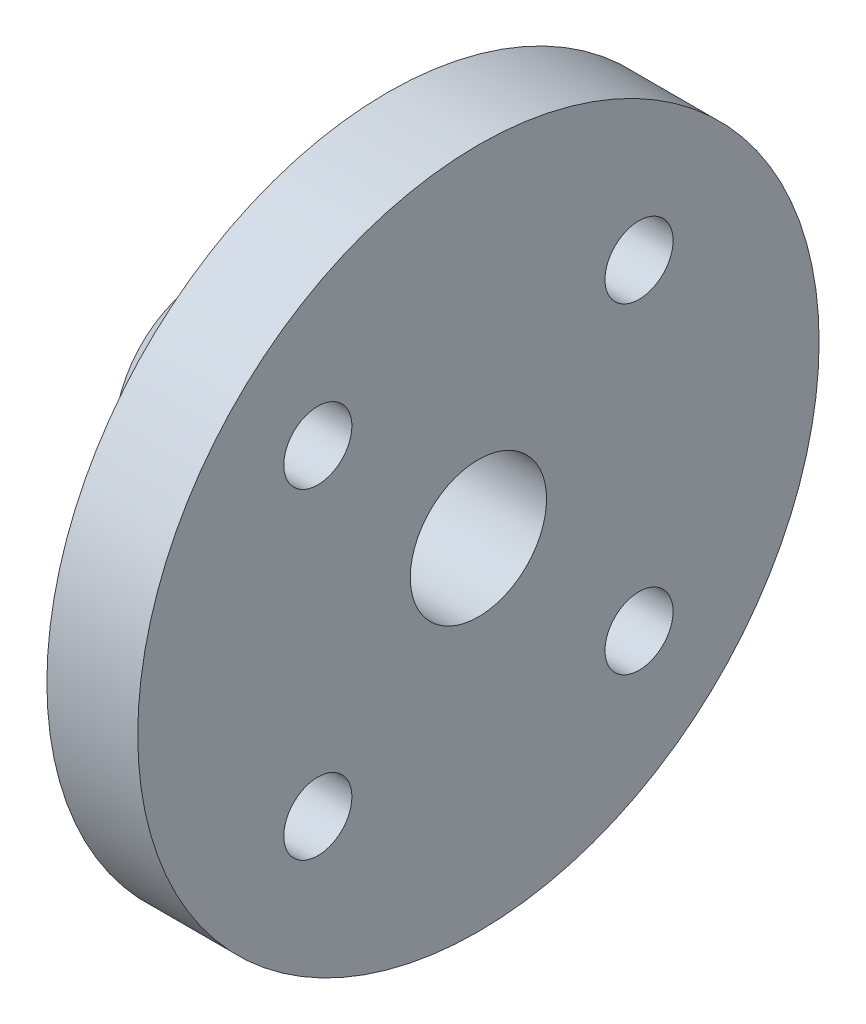
ISO-10303-21;
HEADER;
FILE_DESCRIPTION(('STEP AP214'),'2;1');
FILE_NAME('part.step','',(''),(''),'','','');
FILE_SCHEMA(('AUTOMOTIVE_DESIGN { 1 0 10303 214 1 1 1 1 }'));
ENDSEC;
DATA;
#1=APPLICATION_CONTEXT('core data for automotive mechanical design processes');
#2=APPLICATION_PROTOCOL_DEFINITION('international standard','automotive_design',2000,#1);
#3=PRODUCT_CONTEXT('',#1,'mechanical');
#4=PRODUCT('Part','Part','',(#3));
#5=PRODUCT_RELATED_PRODUCT_CATEGORY('part','',(#4));
#6=PRODUCT_DEFINITION_FORMATION('','',#4);
#7=PRODUCT_DEFINITION_CONTEXT('part definition',#1,'design');
#8=PRODUCT_DEFINITION('design','',#6,#7);
#9=PRODUCT_DEFINITION_SHAPE('','',#8);
#10=(LENGTH_UNIT() NAMED_UNIT(*) SI_UNIT(.MILLI.,.METRE.));
#11=(NAMED_UNIT(*) PLANE_ANGLE_UNIT() SI_UNIT($,.RADIAN.));
#12=(NAMED_UNIT(*) SI_UNIT($,.STERADIAN.) SOLID_ANGLE_UNIT());
#13=UNCERTAINTY_MEASURE_WITH_UNIT(LENGTH_MEASURE(1.E-05),#10,'distance_accuracy_value','');
#14=(GEOMETRIC_REPRESENTATION_CONTEXT(3) GLOBAL_UNCERTAINTY_ASSIGNED_CONTEXT((#13)) GLOBAL_UNIT_ASSIGNED_CONTEXT((#10,
#11,#12)) REPRESENTATION_CONTEXT('',''));
#15=CARTESIAN_POINT('',(0.,0.,0.));
#16=DIRECTION('',(0.,0.,1.));
#17=DIRECTION('',(1.,0.,0.));
#18=AXIS2_PLACEMENT_3D('',#15,#16,#17);
#19=CARTESIAN_POINT('',(0.,0.,0.));
#20=DIRECTION('',(-1.,0.,0.));
#21=DIRECTION('',(0.,0.,1.));
#22=AXIS2_PLACEMENT_3D('',#19,#20,#21);
#23=CYLINDRICAL_SURFACE('',#22,3.);
#24=CARTESIAN_POINT('',(4.,-2.59807621135332,1.5));
#25=CARTESIAN_POINT('',(3.92183828770712,-2.59808302092689,1.4999945446118));
#26=CARTESIAN_POINT('',(3.84357788271243,-2.60165701781635,1.49384995609982));
#27=CARTESIAN_POINT('',(3.68945910298427,-2.61543549678079,1.46958481484708));
#28=CARTESIAN_POINT('',(3.61360612743489,-2.62565391083339,1.45143909683127));
#29=CARTESIAN_POINT('',(3.46682250348409,-2.65124019908098,1.40414992304972));
#30=CARTESIAN_POINT('',(3.39586802128962,-2.66658065209878,1.3750649287406));
#31=CARTESIAN_POINT('',(3.25986369700492,-2.70063997225287,1.30690128806456));
#32=CARTESIAN_POINT('',(3.19481417460631,-2.71935902214097,1.26782210105366));
#33=CARTESIAN_POINT('',(3.06654140716374,-2.75995303586162,1.17699981079632));
#34=CARTESIAN_POINT('',(3.00391129648968,-2.7819609545693,1.12447805421566));
#35=CARTESIAN_POINT('',(2.88788741738994,-2.82557974178559,1.0098807114217));
#36=CARTESIAN_POINT('',(2.83449825612472,-2.84719040746875,0.94780038867344));
#37=CARTESIAN_POINT('',(2.73494927327851,-2.88932215429424,0.81073434512182));
#38=CARTESIAN_POINT('',(2.6895193482107,-2.90967159627259,0.735160783518863));
#39=CARTESIAN_POINT('',(2.61228872013136,-2.94526134149293,0.576235539899257));
#40=CARTESIAN_POINT('',(2.58047941579424,-2.96050486775612,0.492888807207233));
#41=CARTESIAN_POINT('',(2.53374300804835,-2.98320691866356,0.327067415888966));
#42=CARTESIAN_POINT('',(2.5177757104667,-2.99114220331338,0.244952685733227));
#43=CARTESIAN_POINT('',(2.49975082198744,-3.000113757691,0.0788559430467733));
#44=CARTESIAN_POINT('',(2.49768481480643,-3.00115420176885,-0.00512490876560659));
#45=CARTESIAN_POINT('',(2.50712001095552,-2.99644472874675,-0.164748786635624));
#46=CARTESIAN_POINT('',(2.51745702328183,-2.99127743838241,-0.240481798765186));
#47=CARTESIAN_POINT('',(2.54932126585698,-2.97561367889621,-0.388970657877482));
#48=CARTESIAN_POINT('',(2.57084933346433,-2.96511681099591,-0.461726281640887));
#49=CARTESIAN_POINT('',(2.62462384913472,-2.93957374931482,-0.603464087354329));
#50=CARTESIAN_POINT('',(2.6570144697581,-2.92446662293799,-0.672380135272766));
#51=CARTESIAN_POINT('',(2.73139512430224,-2.89106468980031,-0.803965202269992));
#52=CARTESIAN_POINT('',(2.77338859495352,-2.87276874236226,-0.866631973257967));
#53=CARTESIAN_POINT('',(2.87034302729952,-2.83266591598844,-0.990260491347291));
#54=CARTESIAN_POINT('',(2.92615454248901,-2.81069063997263,-1.05050111254404));
#55=CARTESIAN_POINT('',(3.04688458739526,-2.76681510880218,-1.16115655544667));
#56=CARTESIAN_POINT('',(3.11181005841109,-2.74491492398443,-1.21156381736134));
#57=CARTESIAN_POINT('',(3.25397228863613,-2.70216234138727,-1.30425800196332));
#58=CARTESIAN_POINT('',(3.33172903458131,-2.68146479986061,-1.34582597246708));
#59=CARTESIAN_POINT('',(3.4944065070385,-2.64563175417864,-1.41497866950185));
#60=CARTESIAN_POINT('',(3.57931964952634,-2.63049045069101,-1.44257798731633));
#61=CARTESIAN_POINT('',(3.74682176692418,-2.60916953725552,-1.48077031653756));
#62=CARTESIAN_POINT('',(3.82906167856533,-2.60237483772745,-1.49253768317996));
#63=CARTESIAN_POINT('',(3.99460201227481,-2.59676879042414,-1.50227541991714));
#64=CARTESIAN_POINT('',(4.07790164367968,-2.59795180333967,-1.50025553597254));
#65=CARTESIAN_POINT('',(4.23348087786809,-2.60751504810877,-1.48355406501595));
#66=CARTESIAN_POINT('',(4.30596917666189,-2.61509381259981,-1.4702817250687));
#67=CARTESIAN_POINT('',(4.44755167940644,-2.63541032327012,-1.43354442694866));
#68=CARTESIAN_POINT('',(4.51664477611991,-2.64814974007551,-1.41007616793542));
#69=CARTESIAN_POINT('',(4.65311699635404,-2.67804333119485,-1.35247138290733));
#70=CARTESIAN_POINT('',(4.72026852528033,-2.69537464864595,-1.31789109553909));
#71=CARTESIAN_POINT('',(4.84820390730849,-2.73234179245875,-1.23943059602371));
#72=CARTESIAN_POINT('',(4.90898446526992,-2.75197880032721,-1.19554560649832));
#73=CARTESIAN_POINT('',(5.03046815128532,-2.79431997684504,-1.09325575079828));
#74=CARTESIAN_POINT('',(5.09019572607649,-2.81709874731433,-1.03371790847245));
#75=CARTESIAN_POINT('',(5.19911835699038,-2.86101352466839,-0.905106743097435));
#76=CARTESIAN_POINT('',(5.24830985534581,-2.88214897511564,-0.836030211983022));
#77=CARTESIAN_POINT('',(5.33586058892515,-2.92112042536435,-0.687803043838137));
#78=CARTESIAN_POINT('',(5.37389967731636,-2.93885462508044,-0.608434646361171));
#79=CARTESIAN_POINT('',(5.43570685578609,-2.96825032438951,-0.443283546961624));
#80=CARTESIAN_POINT('',(5.45948747704946,-2.97991715514559,-0.357506552088265));
#81=CARTESIAN_POINT('',(5.49005284626199,-2.99501262272824,-0.190469523495627));
#82=CARTESIAN_POINT('',(5.49819681381417,-2.99909891862287,-0.109517165775687));
#83=CARTESIAN_POINT('',(5.5012648981816,-3.00063195562697,0.052688978926804));
#84=CARTESIAN_POINT('',(5.49619364278534,-2.99808102100335,0.133942650442629));
#85=CARTESIAN_POINT('',(5.47387538980656,-2.98700953256884,0.28880698847572));
#86=CARTESIAN_POINT('',(5.45745272611349,-2.97889342001985,0.362568476716895));
#87=CARTESIAN_POINT('',(5.41400950104554,-2.95788140495135,0.506168928275425));
#88=CARTESIAN_POINT('',(5.38698741985982,-2.94498481699194,0.576007327433262));
#89=CARTESIAN_POINT('',(5.32190942175104,-2.9148889612218,0.713135109367326));
#90=CARTESIAN_POINT('',(5.28343101518824,-2.89752925798199,0.780187714050068));
#91=CARTESIAN_POINT('',(5.19706310371142,-2.86032199712739,0.907161962721036));
#92=CARTESIAN_POINT('',(5.14916927632649,-2.84047329837541,0.967080311122359));
#93=CARTESIAN_POINT('',(5.03980429146594,-2.79792915339941,1.08437100623534));
#94=CARTESIAN_POINT('',(4.97745626878421,-2.77514698517547,1.14089652680891));
#95=CARTESIAN_POINT('',(4.84382391830534,-2.73094614244279,1.24299493109201));
#96=CARTESIAN_POINT('',(4.77253176869847,-2.70952868642798,1.28855812501509));
#97=CARTESIAN_POINT('',(4.62004503012857,-2.66999407957374,1.36864661967848));
#98=CARTESIAN_POINT('',(4.53860870330689,-2.65200261384405,1.40277759894141));
#99=CARTESIAN_POINT('',(4.37000139349033,-2.62299234492527,1.45631806425962));
#100=CARTESIAN_POINT('',(4.28285066663097,-2.61195024221553,1.47577678676302));
#101=CARTESIAN_POINT('',(4.162291966522,-2.60293908902686,1.49155051179662));
#102=CARTESIAN_POINT('',(4.12994815840317,-2.60112193507728,1.49471415744578));
#103=CARTESIAN_POINT('',(4.06507527897663,-2.59868903831625,1.49894010763494));
#104=CARTESIAN_POINT('',(4.03254619542119,-2.59807337587664,1.50000227159981));
#105=CARTESIAN_POINT('',(4.,-2.59807621135332,1.5));
#106=B_SPLINE_CURVE_WITH_KNOTS('',3,(#24,#25,#26,#27,#28,#29,#30,#31,#32,#33,#34,#35,#36,#37,
#38,#39,#40,#41,#42,#43,#44,#45,#46,#47,#48,#49,#50,#51,#52,#53,#54,#55,#56,#57,#58,#59,#60,#61,
#62,#63,#64,#65,#66,#67,#68,#69,#70,#71,#72,#73,#74,#75,#76,#77,#78,#79,#80,#81,#82,#83,#84,#85,
#86,#87,#88,#89,#90,#91,#92,#93,#94,#95,#96,#97,#98,#99,#100,#101,#102,#103,#104,#105),
.UNSPECIFIED.,.T.,.F.,(4,2,2,2,2,2,2,2,2,2,2,2,2,2,2,2,2,2,2,2,2,2,2,2,2,2,2,2,2,2,2,2,2,2,2,2,
2,2,2,2,4),(0.,0.234348183892073,0.469189339237207,0.702792893878328,0.936409088167724,
1.18929346874735,1.44230356626556,1.71236838358145,1.98226240445836,2.23295227451903,
2.4834903552906,2.71224146226807,2.94100968776183,3.1729430209672,3.40495949025408,
3.65890787185336,3.91305072368878,4.18333262594173,4.45333161317557,4.70193436281318,
4.95036139782559,5.17161275136038,5.39293578654094,5.62450944609131,5.85620229330071,
6.11710115370919,6.37808797467303,6.64596272119448,6.91360169713157,7.1566840558423,
7.39968130190957,7.62666637307239,7.85368400268019,8.09041126079207,8.32724745151078,
8.58765362775101,8.84828914267731,9.11716123557907,9.3851269950414,9.48270202777964,
9.5802835874181),.UNSPECIFIED.);
#107=CARTESIAN_POINT('',(4.,-2.59807621135332,1.5));
#108=VERTEX_POINT('',#107);
#109=EDGE_CURVE('E71',#108,#108,#106,.T.);
#110=ORIENTED_EDGE('',*,*,#109,.T.);
#111=EDGE_LOOP('',(#110));
#112=FACE_BOUND('',#111,.T.);
#113=CARTESIAN_POINT('',(12.,0.,0.));
#114=DIRECTION('',(-1.,0.,0.));
#115=DIRECTION('',(0.,0.,1.));
#116=AXIS2_PLACEMENT_3D('',#113,#114,#115);
#117=CIRCLE('',#116,3.);
#118=CARTESIAN_POINT('',(12.,0.,3.));
#119=VERTEX_POINT('',#118);
#120=EDGE_CURVE('E40',#119,#119,#117,.T.);
#121=ORIENTED_EDGE('',*,*,#120,.F.);
#122=EDGE_LOOP('',(#121));
#123=FACE_BOUND('',#122,.T.);
#124=CARTESIAN_POINT('',(0.,0.,0.));
#125=DIRECTION('',(-1.,0.,0.));
#126=DIRECTION('',(0.,0.,1.));
#127=AXIS2_PLACEMENT_3D('',#124,#125,#126);
#128=CIRCLE('',#127,3.);
#129=CARTESIAN_POINT('',(0.,0.,3.));
#130=VERTEX_POINT('',#129);
#131=EDGE_CURVE('E78',#130,#130,#128,.T.);
#132=ORIENTED_EDGE('',*,*,#131,.T.);
#133=EDGE_LOOP('',(#132));
#134=FACE_BOUND('',#133,.T.);
#135=ADVANCED_FACE('F32',(#112,#123,#134),#23,.F.);
#136=CARTESIAN_POINT('',(12.,3.,0.));
#137=DIRECTION('',(-1.,0.,0.));
#138=DIRECTION('',(0.,0.,1.));
#139=AXIS2_PLACEMENT_3D('',#136,#137,#138);
#140=PLANE('',#139);
#141=CARTESIAN_POINT('',(12.,-7.07106781186549,7.07106781186546));
#142=DIRECTION('',(1.,0.,0.));
#143=DIRECTION('',(0.,0.,-1.));
#144=AXIS2_PLACEMENT_3D('',#141,#142,#143);
#145=CIRCLE('',#144,1.49999999999999);
#146=CARTESIAN_POINT('',(12.,-7.07106781186549,5.57106781186547));
#147=VERTEX_POINT('',#146);
#148=EDGE_CURVE('E219',#147,#147,#145,.T.);
#149=ORIENTED_EDGE('',*,*,#148,.F.);
#150=EDGE_LOOP('',(#149));
#151=FACE_BOUND('',#150,.T.);
#152=CARTESIAN_POINT('',(12.,-7.07106781186546,-7.07106781186549));
#153=DIRECTION('',(1.,0.,0.));
#154=DIRECTION('',(0.,0.,-1.));
#155=AXIS2_PLACEMENT_3D('',#152,#153,#154);
#156=CIRCLE('',#155,1.49999999999999);
#157=CARTESIAN_POINT('',(12.,-7.07106781186546,-8.57106781186548));
#158=VERTEX_POINT('',#157);
#159=EDGE_CURVE('E237',#158,#158,#156,.T.);
#160=ORIENTED_EDGE('',*,*,#159,.F.);
#161=EDGE_LOOP('',(#160));
#162=FACE_BOUND('',#161,.T.);
#163=CARTESIAN_POINT('',(12.,7.07106781186549,-7.07106781186546));
#164=DIRECTION('',(1.,0.,0.));
#165=DIRECTION('',(0.,0.,-1.));
#166=AXIS2_PLACEMENT_3D('',#163,#164,#165);
#167=CIRCLE('',#166,1.5);
#168=CARTESIAN_POINT('',(12.,7.07106781186549,-8.57106781186546));
#169=VERTEX_POINT('',#168);
#170=EDGE_CURVE('E234',#169,#169,#167,.T.);
#171=ORIENTED_EDGE('',*,*,#170,.F.);
#172=EDGE_LOOP('',(#171));
#173=FACE_BOUND('',#172,.T.);
#174=CARTESIAN_POINT('',(12.,7.07106781186546,7.07106781186549));
#175=DIRECTION('',(1.,0.,0.));
#176=DIRECTION('',(0.,0.,-1.));
#177=AXIS2_PLACEMENT_3D('',#174,#175,#176);
#178=CIRCLE('',#177,1.5);
#179=CARTESIAN_POINT('',(12.,7.07106781186546,5.57106781186549));
#180=VERTEX_POINT('',#179);
#181=EDGE_CURVE('E79',#180,#180,#178,.T.);
#182=ORIENTED_EDGE('',*,*,#181,.F.);
#183=EDGE_LOOP('',(#182));
#184=FACE_BOUND('',#183,.T.);
#185=CARTESIAN_POINT('',(12.,0.,0.));
#186=DIRECTION('',(-1.,0.,0.));
#187=DIRECTION('',(0.,0.,1.));
#188=AXIS2_PLACEMENT_3D('',#185,#186,#187);
#189=CIRCLE('',#188,15.);
#190=CARTESIAN_POINT('',(12.,0.,15.));
#191=VERTEX_POINT('',#190);
#192=EDGE_CURVE('E45',#191,#191,#189,.T.);
#193=ORIENTED_EDGE('',*,*,#192,.F.);
#194=EDGE_LOOP('',(#193));
#195=FACE_BOUND('',#194,.T.);
#196=ORIENTED_EDGE('',*,*,#120,.T.);
#197=EDGE_LOOP('',(#196));
#198=FACE_BOUND('',#197,.T.);
#199=ADVANCED_FACE('F99',(#151,#162,#173,#184,#195,#198),#140,.F.);
#200=CARTESIAN_POINT('',(0.,0.,0.));
#201=DIRECTION('',(-1.,0.,0.));
#202=DIRECTION('',(0.,0.,1.));
#203=AXIS2_PLACEMENT_3D('',#200,#201,#202);
#204=CYLINDRICAL_SURFACE('',#203,15.);
#205=CARTESIAN_POINT('',(8.,0.,0.));
#206=DIRECTION('',(-1.,0.,0.));
#207=DIRECTION('',(0.,0.,1.));
#208=AXIS2_PLACEMENT_3D('',#205,#206,#207);
#209=CIRCLE('',#208,15.);
#210=CARTESIAN_POINT('',(8.,0.,15.));
#211=VERTEX_POINT('',#210);
#212=EDGE_CURVE('E92',#211,#211,#209,.T.);
#213=ORIENTED_EDGE('',*,*,#212,.F.);
#214=EDGE_LOOP('',(#213));
#215=FACE_BOUND('',#214,.T.);
#216=ORIENTED_EDGE('',*,*,#192,.T.);
#217=EDGE_LOOP('',(#216));
#218=FACE_BOUND('',#217,.T.);
#219=ADVANCED_FACE('F97',(#215,#218),#204,.T.);
#220=CARTESIAN_POINT('',(8.,15.,0.));
#221=DIRECTION('',(1.,0.,0.));
#222=DIRECTION('',(0.,0.,-1.));
#223=AXIS2_PLACEMENT_3D('',#220,#221,#222);
#224=PLANE('',#223);
#225=CARTESIAN_POINT('',(8.,-7.07106781186549,7.07106781186546));
#226=DIRECTION('',(1.,0.,0.));
#227=DIRECTION('',(0.,0.,-1.));
#228=AXIS2_PLACEMENT_3D('',#225,#226,#227);
#229=CIRCLE('',#228,1.49999999999999);
#230=CARTESIAN_POINT('',(8.,-7.07106781186549,5.57106781186547));
#231=VERTEX_POINT('',#230);
#232=EDGE_CURVE('E36',#231,#231,#229,.T.);
#233=ORIENTED_EDGE('',*,*,#232,.T.);
#234=EDGE_LOOP('',(#233));
#235=FACE_BOUND('',#234,.T.);
#236=CARTESIAN_POINT('',(8.,-7.07106781186546,-7.07106781186549));
#237=DIRECTION('',(1.,0.,0.));
#238=DIRECTION('',(0.,0.,-1.));
#239=AXIS2_PLACEMENT_3D('',#236,#237,#238);
#240=CIRCLE('',#239,1.49999999999999);
#241=CARTESIAN_POINT('',(8.,-7.07106781186546,-8.57106781186548));
#242=VERTEX_POINT('',#241);
#243=EDGE_CURVE('E222',#242,#242,#240,.T.);
#244=ORIENTED_EDGE('',*,*,#243,.T.);
#245=EDGE_LOOP('',(#244));
#246=FACE_BOUND('',#245,.T.);
#247=CARTESIAN_POINT('',(8.,7.07106781186549,-7.07106781186546));
#248=DIRECTION('',(1.,0.,0.));
#249=DIRECTION('',(0.,0.,-1.));
#250=AXIS2_PLACEMENT_3D('',#247,#248,#249);
#251=CIRCLE('',#250,1.5);
#252=CARTESIAN_POINT('',(8.,7.07106781186549,-8.57106781186546));
#253=VERTEX_POINT('',#252);
#254=EDGE_CURVE('E224',#253,#253,#251,.T.);
#255=ORIENTED_EDGE('',*,*,#254,.T.);
#256=EDGE_LOOP('',(#255));
#257=FACE_BOUND('',#256,.T.);
#258=CARTESIAN_POINT('',(8.,7.07106781186546,7.07106781186549));
#259=DIRECTION('',(1.,0.,0.));
#260=DIRECTION('',(0.,0.,-1.));
#261=AXIS2_PLACEMENT_3D('',#258,#259,#260);
#262=CIRCLE('',#261,1.5);
#263=CARTESIAN_POINT('',(8.,7.07106781186546,5.57106781186549));
#264=VERTEX_POINT('',#263);
#265=EDGE_CURVE('E54',#264,#264,#262,.T.);
#266=ORIENTED_EDGE('',*,*,#265,.T.);
#267=EDGE_LOOP('',(#266));
#268=FACE_BOUND('',#267,.T.);
#269=CARTESIAN_POINT('',(8.,0.,0.));
#270=DIRECTION('',(-1.,0.,0.));
#271=DIRECTION('',(0.,0.,1.));
#272=AXIS2_PLACEMENT_3D('',#269,#270,#271);
#273=CIRCLE('',#272,5.);
#274=CARTESIAN_POINT('',(8.,0.,5.));
#275=VERTEX_POINT('',#274);
#276=EDGE_CURVE('E89',#275,#275,#273,.T.);
#277=ORIENTED_EDGE('',*,*,#276,.F.);
#278=EDGE_LOOP('',(#277));
#279=FACE_BOUND('',#278,.T.);
#280=ORIENTED_EDGE('',*,*,#212,.T.);
#281=EDGE_LOOP('',(#280));
#282=FACE_BOUND('',#281,.T.);
#283=ADVANCED_FACE('F121',(#235,#246,#257,#268,#279,#282),#224,.F.);
#284=CARTESIAN_POINT('',(0.,0.,0.));
#285=DIRECTION('',(-1.,0.,0.));
#286=DIRECTION('',(0.,0.,1.));
#287=AXIS2_PLACEMENT_3D('',#284,#285,#286);
#288=CYLINDRICAL_SURFACE('',#287,5.);
#289=CARTESIAN_POINT('',(2.5,-5.,0.));
#290=CARTESIAN_POINT('',(2.50000099748488,-4.9999992925055,0.0822886127532998));
#291=CARTESIAN_POINT('',(2.50679386362397,-4.99794915693953,0.164587318351529));
#292=CARTESIAN_POINT('',(2.5337213542221,-4.98997105593691,0.32678812530488));
#293=CARTESIAN_POINT('',(2.55385995802334,-4.98404193389692,0.406689504411419));
#294=CARTESIAN_POINT('',(2.60674601691026,-4.96895552501836,0.561732707754526));
#295=CARTESIAN_POINT('',(2.63947486961894,-4.95980300250425,0.636881364395372));
#296=CARTESIAN_POINT('',(2.71653609305583,-4.93922109237645,0.780624181053131));
#297=CARTESIAN_POINT('',(2.76087000739542,-4.92779140192067,0.849217467469668));
#298=CARTESIAN_POINT('',(2.86122400747267,-4.90350737192774,0.979871797183744));
#299=CARTESIAN_POINT('',(2.91751662588591,-4.89062383657036,1.04171807124434));
#300=CARTESIAN_POINT('',(3.03960922991018,-4.86505834210442,1.15524920923324));
#301=CARTESIAN_POINT('',(3.10541081212496,-4.85237641724501,1.20693236327441));
#302=CARTESIAN_POINT('',(3.24647075303761,-4.82834113993772,1.29980037723708));
#303=CARTESIAN_POINT('',(3.32190846099074,-4.81702406663875,1.34072309022213));
#304=CARTESIAN_POINT('',(3.47898925423029,-4.79743620394031,1.4092139477476));
#305=CARTESIAN_POINT('',(3.56063084392797,-4.78916468313311,1.43678529919973));
#306=CARTESIAN_POINT('',(3.72539026613046,-4.77690870838434,1.47701633682652));
#307=CARTESIAN_POINT('',(3.80840274386394,-4.77281069324533,1.49007196234677));
#308=CARTESIAN_POINT('',(3.97553315621676,-4.76902789749767,1.50213730614672));
#309=CARTESIAN_POINT('',(4.05965081805908,-4.76934204760571,1.50115042761078));
#310=CARTESIAN_POINT('',(4.22338390860848,-4.77424744067778,1.48546977199812));
#311=CARTESIAN_POINT('',(4.30305225036224,-4.7786838859914,1.47127205262685));
#312=CARTESIAN_POINT('',(4.45881978627346,-4.79108356228624,1.43037420427056));
#313=CARTESIAN_POINT('',(4.53491862737433,-4.7990471413235,1.40367284141641));
#314=CARTESIAN_POINT('',(4.68260034966074,-4.81772733074973,1.33816026653682));
#315=CARTESIAN_POINT('',(4.75410708395526,-4.82848016115952,1.29918816934642));
#316=CARTESIAN_POINT('',(4.88973202201019,-4.85150987000064,1.21035222588683));
#317=CARTESIAN_POINT('',(4.95384842941378,-4.86378711746991,1.16048574002588));
#318=CARTESIAN_POINT('',(5.07568619076202,-4.88911011297937,1.04881290765546));
#319=CARTESIAN_POINT('',(5.13302866402967,-4.90216654310498,0.986594907466972));
#320=CARTESIAN_POINT('',(5.23655398406425,-4.92712244063258,0.853263259313967));
#321=CARTESIAN_POINT('',(5.28273612841442,-4.9390218351841,0.782149051860888));
#322=CARTESIAN_POINT('',(5.36285992246473,-4.9604316006947,0.632355038342803));
#323=CARTESIAN_POINT('',(5.39671751624986,-4.96992543668314,0.553627749747951));
#324=CARTESIAN_POINT('',(5.45059959009963,-4.98533521832222,0.39124541560352));
#325=CARTESIAN_POINT('',(5.47062792853249,-4.99125216186999,0.307591751589582));
#326=CARTESIAN_POINT('',(5.49565217789939,-4.99868364643538,0.140952242668332));
#327=CARTESIAN_POINT('',(5.50116158580161,-5.0003485041779,0.0580500976011874));
#328=CARTESIAN_POINT('',(5.49843084428792,-4.99952923241759,-0.107499605823382));
#329=CARTESIAN_POINT('',(5.49019253034856,-4.99704565677756,-0.19014719669078));
#330=CARTESIAN_POINT('',(5.4606153888885,-4.98830696987163,-0.350903605309696));
#331=CARTESIAN_POINT('',(5.43957661241913,-4.98213829799417,-0.429072772614168));
#332=CARTESIAN_POINT('',(5.3853567672218,-4.96674347841532,-0.580754638954521));
#333=CARTESIAN_POINT('',(5.35217423896214,-4.95751696321085,-0.654266777025583));
#334=CARTESIAN_POINT('',(5.27374683451887,-4.93669654351325,-0.796437189461051));
#335=CARTESIAN_POINT('',(5.22824065905203,-4.92505280829675,-0.864943826199669));
#336=CARTESIAN_POINT('',(5.12677524594719,-4.90073468764317,-0.993523307980146));
#337=CARTESIAN_POINT('',(5.07081338811233,-4.8880600443108,-1.05359403235593));
#338=CARTESIAN_POINT('',(4.94761269163065,-4.86253171869138,-1.16585744551027));
#339=CARTESIAN_POINT('',(4.88003812422826,-4.84968825033268,-1.21768481231503));
#340=CARTESIAN_POINT('',(4.73687206098647,-4.82576515238463,-1.30928995072153));
#341=CARTESIAN_POINT('',(4.66128077544178,-4.81468547654651,-1.34906803829472));
#342=CARTESIAN_POINT('',(4.50446750874531,-4.79567189615055,-1.41517347127168));
#343=CARTESIAN_POINT('',(4.42327381346341,-4.78772337843827,-1.4415634693705));
#344=CARTESIAN_POINT('',(4.25731203106852,-4.77591594362794,-1.48021730815114));
#345=CARTESIAN_POINT('',(4.17254517921233,-4.772055625083,-1.49248598978779));
#346=CARTESIAN_POINT('',(4.00563848162377,-4.76899972496087,-1.50221984485059));
#347=CARTESIAN_POINT('',(3.92353634898241,-4.76961647442754,-1.5002805530849));
#348=CARTESIAN_POINT('',(3.7608858966272,-4.77499401288294,-1.48307505444813));
#349=CARTESIAN_POINT('',(3.68033751482365,-4.77975463592551,-1.46780938124716));
#350=CARTESIAN_POINT('',(3.52405460085715,-4.79275763670385,-1.42476888804136));
#351=CARTESIAN_POINT('',(3.44827271263831,-4.80095604545965,-1.39715175507068));
#352=CARTESIAN_POINT('',(3.30235756118228,-4.81990278909136,-1.33031507121129));
#353=CARTESIAN_POINT('',(3.23222538235924,-4.83065161194312,-1.29109329962876));
#354=CARTESIAN_POINT('',(3.09683688347289,-4.85397676425833,-1.20048763805072));
#355=CARTESIAN_POINT('',(3.03185123873959,-4.86660540163797,-1.14871276092994));
#356=CARTESIAN_POINT('',(2.91129750169214,-4.89201320450026,-1.03517434629782));
#357=CARTESIAN_POINT('',(2.85573186053224,-4.90479240823905,-0.973408217134502));
#358=CARTESIAN_POINT('',(2.75397658770497,-4.92950936570649,-0.839465762183249));
#359=CARTESIAN_POINT('',(2.70810855314451,-4.94141159765674,-0.767037885790609));
#360=CARTESIAN_POINT('',(2.62926483009597,-4.96260680455813,-0.615141373983531));
#361=CARTESIAN_POINT('',(2.59628311172549,-4.97190099931066,-0.535676052998956));
#362=CARTESIAN_POINT('',(2.54710472434725,-4.98602174969301,-0.380757712655282));
#363=CARTESIAN_POINT('',(2.52948832711675,-4.99122027381067,-0.305786961954235));
#364=CARTESIAN_POINT('',(2.50593647475842,-4.99820944494492,-0.15388019523078));
#365=CARTESIAN_POINT('',(2.49999906729518,-5.0000006615474,-0.0769445098581397));
#366=CARTESIAN_POINT('',(2.5,-5.,0.));
#367=B_SPLINE_CURVE_WITH_KNOTS('',3,(#289,#290,#291,#292,#293,#294,#295,#296,#297,#298,#299,
#300,#301,#302,#303,#304,#305,#306,#307,#308,#309,#310,#311,#312,#313,#314,#315,#316,#317,#318,
#319,#320,#321,#322,#323,#324,#325,#326,#327,#328,#329,#330,#331,#332,#333,#334,#335,#336,#337,
#338,#339,#340,#341,#342,#343,#344,#345,#346,#347,#348,#349,#350,#351,#352,#353,#354,#355,#356,
#357,#358,#359,#360,#361,#362,#363,#364,#365,#366),.UNSPECIFIED.,.T.,.F.,(4,2,2,2,2,2,2,2,2,2,2,
2,2,2,2,2,2,2,2,2,2,2,2,2,2,2,2,2,2,2,2,2,2,2,2,2,2,2,4),(0.,0.24658320361261,0.493239964845999,
0.739533676300874,0.985860164412701,1.23855602948191,1.49129437288633,1.74971481004109,
2.00807314543223,2.25919689356599,2.51025978319089,2.75226016697676,2.99428443658001,
3.23962426447119,3.48502360158555,3.74067104048166,3.99633456531071,4.25371046881688,
4.51101453528807,4.75908809438545,5.00712853550326,5.24956746682326,5.49203554593728,
5.74011305702908,5.98825282000191,6.24540400322818,6.5025484425268,6.75847814951251,
7.01432009460282,7.25950155466942,7.50467319661599,7.7468004040272,7.98897397553107,
8.2399692567993,8.49102974897502,8.7494299615667,9.00770911595235,9.23831691930459,
9.46888616948874),.UNSPECIFIED.);
#368=CARTESIAN_POINT('',(2.5,-5.,0.));
#369=VERTEX_POINT('',#368);
#370=EDGE_CURVE('E10',#369,#369,#367,.T.);
#371=ORIENTED_EDGE('',*,*,#370,.T.);
#372=EDGE_LOOP('',(#371));
#373=FACE_BOUND('',#372,.T.);
#374=CARTESIAN_POINT('',(1.,0.,0.));
#375=DIRECTION('',(-1.,0.,0.));
#376=DIRECTION('',(0.,0.,1.));
#377=AXIS2_PLACEMENT_3D('',#374,#375,#376);
#378=CIRCLE('',#377,5.);
#379=CARTESIAN_POINT('',(1.,0.,5.));
#380=VERTEX_POINT('',#379);
#381=EDGE_CURVE('E86',#380,#380,#378,.T.);
#382=ORIENTED_EDGE('',*,*,#381,.F.);
#383=EDGE_LOOP('',(#382));
#384=FACE_BOUND('',#383,.T.);
#385=ORIENTED_EDGE('',*,*,#276,.T.);
#386=EDGE_LOOP('',(#385));
#387=FACE_BOUND('',#386,.T.);
#388=ADVANCED_FACE('F56',(#373,#384,#387),#288,.T.);
#389=CARTESIAN_POINT('',(1.,0.,0.));
#390=DIRECTION('',(1.,0.,0.));
#391=DIRECTION('',(0.,0.,-1.));
#392=AXIS2_PLACEMENT_3D('',#389,#390,#391);
#393=CONICAL_SURFACE('',#392,5.,0.785398163397448);
#394=CARTESIAN_POINT('',(0.,0.,0.));
#395=DIRECTION('',(-1.,0.,0.));
#396=DIRECTION('',(0.,0.,1.));
#397=AXIS2_PLACEMENT_3D('',#394,#395,#396);
#398=CIRCLE('',#397,4.);
#399=CARTESIAN_POINT('',(0.,0.,4.));
#400=VERTEX_POINT('',#399);
#401=EDGE_CURVE('E83',#400,#400,#398,.T.);
#402=ORIENTED_EDGE('',*,*,#401,.F.);
#403=EDGE_LOOP('',(#402));
#404=FACE_BOUND('',#403,.T.);
#405=ORIENTED_EDGE('',*,*,#381,.T.);
#406=EDGE_LOOP('',(#405));
#407=FACE_BOUND('',#406,.T.);
#408=ADVANCED_FACE('F112',(#404,#407),#393,.T.);
#409=CARTESIAN_POINT('',(0.,4.,0.));
#410=DIRECTION('',(1.,0.,0.));
#411=DIRECTION('',(0.,0.,-1.));
#412=AXIS2_PLACEMENT_3D('',#409,#410,#411);
#413=PLANE('',#412);
#414=ORIENTED_EDGE('',*,*,#131,.F.);
#415=EDGE_LOOP('',(#414));
#416=FACE_BOUND('',#415,.T.);
#417=ORIENTED_EDGE('',*,*,#401,.T.);
#418=EDGE_LOOP('',(#417));
#419=FACE_BOUND('',#418,.T.);
#420=ADVANCED_FACE('F66',(#416,#419),#413,.F.);
#421=CARTESIAN_POINT('',(4.,-5.,0.));
#422=DIRECTION('',(0.,1.,0.));
#423=DIRECTION('',(0.,0.,1.));
#424=AXIS2_PLACEMENT_3D('',#421,#422,#423);
#425=CYLINDRICAL_SURFACE('',#424,1.5);
#426=ORIENTED_EDGE('',*,*,#370,.F.);
#427=EDGE_LOOP('',(#426));
#428=FACE_BOUND('',#427,.T.);
#429=ORIENTED_EDGE('',*,*,#109,.F.);
#430=EDGE_LOOP('',(#429));
#431=FACE_BOUND('',#430,.T.);
#432=ADVANCED_FACE('F60',(#428,#431),#425,.F.);
#433=CARTESIAN_POINT('',(0.,7.07106781186546,7.07106781186549));
#434=DIRECTION('',(1.,0.,0.));
#435=DIRECTION('',(0.,0.,-1.));
#436=AXIS2_PLACEMENT_3D('',#433,#434,#435);
#437=CYLINDRICAL_SURFACE('',#436,1.5);
#438=ORIENTED_EDGE('',*,*,#181,.T.);
#439=EDGE_LOOP('',(#438));
#440=FACE_BOUND('',#439,.T.);
#441=ORIENTED_EDGE('',*,*,#265,.F.);
#442=EDGE_LOOP('',(#441));
#443=FACE_BOUND('',#442,.T.);
#444=ADVANCED_FACE('F65',(#440,#443),#437,.F.);
#445=CARTESIAN_POINT('',(0.,7.07106781186549,-7.07106781186546));
#446=DIRECTION('',(1.,0.,0.));
#447=DIRECTION('',(0.,0.,-1.));
#448=AXIS2_PLACEMENT_3D('',#445,#446,#447);
#449=CYLINDRICAL_SURFACE('',#448,1.5);
#450=ORIENTED_EDGE('',*,*,#170,.T.);
#451=EDGE_LOOP('',(#450));
#452=FACE_BOUND('',#451,.T.);
#453=ORIENTED_EDGE('',*,*,#254,.F.);
#454=EDGE_LOOP('',(#453));
#455=FACE_BOUND('',#454,.T.);
#456=ADVANCED_FACE('F162',(#452,#455),#449,.F.);
#457=CARTESIAN_POINT('',(0.,-7.07106781186546,-7.07106781186549));
#458=DIRECTION('',(1.,0.,0.));
#459=DIRECTION('',(0.,0.,-1.));
#460=AXIS2_PLACEMENT_3D('',#457,#458,#459);
#461=CYLINDRICAL_SURFACE('',#460,1.49999999999999);
#462=ORIENTED_EDGE('',*,*,#159,.T.);
#463=EDGE_LOOP('',(#462));
#464=FACE_BOUND('',#463,.T.);
#465=ORIENTED_EDGE('',*,*,#243,.F.);
#466=EDGE_LOOP('',(#465));
#467=FACE_BOUND('',#466,.T.);
#468=ADVANCED_FACE('F169',(#464,#467),#461,.F.);
#469=CARTESIAN_POINT('',(0.,-7.07106781186549,7.07106781186546));
#470=DIRECTION('',(1.,0.,0.));
#471=DIRECTION('',(0.,0.,-1.));
#472=AXIS2_PLACEMENT_3D('',#469,#470,#471);
#473=CYLINDRICAL_SURFACE('',#472,1.49999999999999);
#474=ORIENTED_EDGE('',*,*,#148,.T.);
#475=EDGE_LOOP('',(#474));
#476=FACE_BOUND('',#475,.T.);
#477=ORIENTED_EDGE('',*,*,#232,.F.);
#478=EDGE_LOOP('',(#477));
#479=FACE_BOUND('',#478,.T.);
#480=ADVANCED_FACE('F177',(#476,#479),#473,.F.);
#481=CLOSED_SHELL('',(#135,#199,#219,#283,#388,#408,#420,#432,#444,#456,#468,#480));
#482=MANIFOLD_SOLID_BREP('B2',#481);
#483=ADVANCED_BREP_SHAPE_REPRESENTATION('',(#18,#482),#14);
#484=SHAPE_DEFINITION_REPRESENTATION(#9,#483);
ENDSEC;
END-ISO-10303-21;
